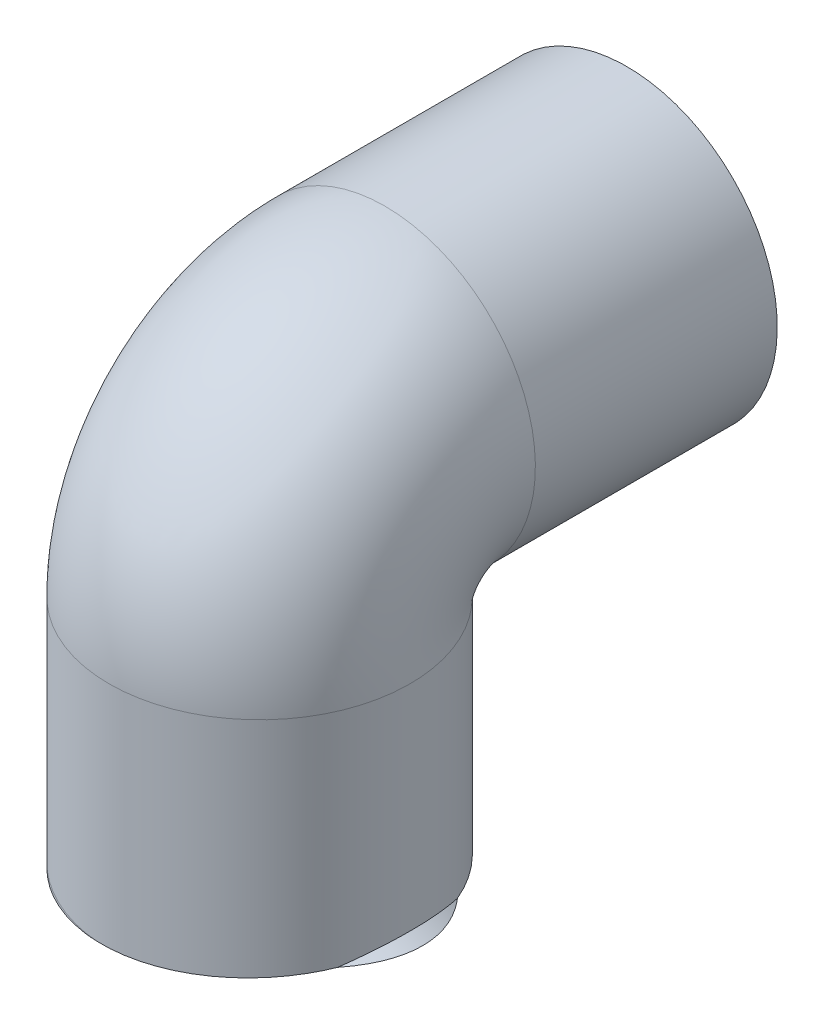
ISO-10303-21;
HEADER;
FILE_DESCRIPTION(('STEP AP214'),'2;1');
FILE_NAME('part.step','',(''),(''),'','','');
FILE_SCHEMA(('AUTOMOTIVE_DESIGN { 1 0 10303 214 1 1 1 1 }'));
ENDSEC;
DATA;
#1=APPLICATION_CONTEXT('core data for automotive mechanical design processes');
#2=APPLICATION_PROTOCOL_DEFINITION('international standard','automotive_design',2000,#1);
#3=PRODUCT_CONTEXT('',#1,'mechanical');
#4=PRODUCT('Part','Part','',(#3));
#5=PRODUCT_RELATED_PRODUCT_CATEGORY('part','',(#4));
#6=PRODUCT_DEFINITION_FORMATION('','',#4);
#7=PRODUCT_DEFINITION_CONTEXT('part definition',#1,'design');
#8=PRODUCT_DEFINITION('design','',#6,#7);
#9=PRODUCT_DEFINITION_SHAPE('','',#8);
#10=(LENGTH_UNIT() NAMED_UNIT(*) SI_UNIT(.MILLI.,.METRE.));
#11=(NAMED_UNIT(*) PLANE_ANGLE_UNIT() SI_UNIT($,.RADIAN.));
#12=(NAMED_UNIT(*) SI_UNIT($,.STERADIAN.) SOLID_ANGLE_UNIT());
#13=UNCERTAINTY_MEASURE_WITH_UNIT(LENGTH_MEASURE(1.E-05),#10,'distance_accuracy_value','');
#14=(GEOMETRIC_REPRESENTATION_CONTEXT(3) GLOBAL_UNCERTAINTY_ASSIGNED_CONTEXT((#13)) GLOBAL_UNIT_ASSIGNED_CONTEXT((#10,
#11,#12)) REPRESENTATION_CONTEXT('',''));
#15=CARTESIAN_POINT('',(0.,0.,0.));
#16=DIRECTION('',(0.,0.,1.));
#17=DIRECTION('',(1.,0.,0.));
#18=AXIS2_PLACEMENT_3D('',#15,#16,#17);
#19=CARTESIAN_POINT('',(-45.,-9.99999999999998,29.2902720223651));
#20=DIRECTION('',(0.,-1.,0.));
#21=DIRECTION('',(0.,0.,-1.));
#22=AXIS2_PLACEMENT_3D('',#19,#20,#21);
#23=CYLINDRICAL_SURFACE('',#22,12.);
#24=CARTESIAN_POINT('',(-45.,-28.3117979739499,29.2902720223659));
#25=DIRECTION('',(0.,-1.,0.));
#26=DIRECTION('',(0.,0.,-1.));
#27=AXIS2_PLACEMENT_3D('',#24,#25,#26);
#28=CIRCLE('',#27,12.);
#29=CARTESIAN_POINT('',(-46.0483542686489,-28.3117979739504,17.3361533460516));
#30=VERTEX_POINT('',#29);
#31=CARTESIAN_POINT('',(-46.0483542686296,-28.3117979739494,41.2443906986818));
#32=VERTEX_POINT('',#31);
#33=EDGE_CURVE('E115',#30,#32,#28,.F.);
#34=ORIENTED_EDGE('',*,*,#33,.T.);
#35=CARTESIAN_POINT('',(-45.,-28.2577590941231,29.2902720223659));
#36=DIRECTION('',(-0.0514780477489432,0.998674126329484,0.));
#37=DIRECTION('',(-0.998674126329484,-0.0514780477489432,8.06030191765794E-13));
#38=AXIS2_PLACEMENT_3D('',#35,#36,#37);
#39=ELLIPSE('',#38,12.0159316073449,12.);
#40=CARTESIAN_POINT('',(-33.9907188725222,-27.6902703762118,34.0647593305657));
#41=VERTEX_POINT('',#40);
#42=EDGE_CURVE('E62',#41,#32,#39,.F.);
#43=ORIENTED_EDGE('',*,*,#42,.F.);
#44=CARTESIAN_POINT('',(-45.,-34.4699196390855,29.290272022366));
#45=DIRECTION('',(0.524361459695173,-0.851495777785391,8.28774193656232E-13));
#46=DIRECTION('',(-0.851495777785391,-0.524361459695173,-1.26669276251364E-12));
#47=AXIS2_PLACEMENT_3D('',#44,#45,#46);
#48=ELLIPSE('',#47,14.0928473317979,12.);
#49=CARTESIAN_POINT('',(-33.9907188725057,-27.690270376211,24.5157847142039));
#50=VERTEX_POINT('',#49);
#51=EDGE_CURVE('E55',#50,#41,#48,.T.);
#52=ORIENTED_EDGE('',*,*,#51,.F.);
#53=EDGE_CURVE('E126',#30,#50,#39,.F.);
#54=ORIENTED_EDGE('',*,*,#53,.F.);
#55=EDGE_LOOP('',(#34,#43,#52,#54));
#56=FACE_BOUND('',#55,.T.);
#57=CARTESIAN_POINT('',(-45.,-9.99999999999997,29.2902720223651));
#58=DIRECTION('',(0.,1.,0.));
#59=DIRECTION('',(0.,0.,1.));
#60=AXIS2_PLACEMENT_3D('',#57,#58,#59);
#61=CIRCLE('',#60,12.);
#62=CARTESIAN_POINT('',(-51.6332495807108,-9.99999999999998,19.2902720223653));
#63=VERTEX_POINT('',#62);
#64=CARTESIAN_POINT('',(-38.3667504192892,-9.99999999999997,19.2902720223651));
#65=VERTEX_POINT('',#64);
#66=EDGE_CURVE('E112',#63,#65,#61,.T.);
#67=ORIENTED_EDGE('',*,*,#66,.F.);
#68=CARTESIAN_POINT('',(-45.,0.,29.2902720223647));
#69=DIRECTION('',(0.,-0.707106781186533,0.707106781186562));
#70=DIRECTION('',(0.,0.707106781186562,0.707106781186533));
#71=AXIS2_PLACEMENT_3D('',#68,#69,#70);
#72=ELLIPSE('',#71,16.9705627484768,12.);
#73=EDGE_CURVE('E12',#63,#65,#72,.T.);
#74=ORIENTED_EDGE('',*,*,#73,.T.);
#75=EDGE_LOOP('',(#67,#74));
#76=FACE_BOUND('',#75,.T.);
#77=ADVANCED_FACE('F47',(#56,#76),#23,.T.);
#78=CARTESIAN_POINT('',(-45.,0.,0.));
#79=DIRECTION('',(0.,0.,1.));
#80=DIRECTION('',(0.,-1.,0.));
#81=AXIS2_PLACEMENT_3D('',#78,#79,#80);
#82=CYLINDRICAL_SURFACE('',#81,12.);
#83=CARTESIAN_POINT('',(-45.,0.,0.));
#84=DIRECTION('',(0.,0.,-1.));
#85=DIRECTION('',(-1.,0.,0.));
#86=AXIS2_PLACEMENT_3D('',#83,#84,#85);
#87=CIRCLE('',#86,12.);
#88=CARTESIAN_POINT('',(-57.,0.,0.));
#89=VERTEX_POINT('',#88);
#90=EDGE_CURVE('E100',#89,#89,#87,.T.);
#91=ORIENTED_EDGE('',*,*,#90,.F.);
#92=EDGE_LOOP('',(#91));
#93=FACE_BOUND('',#92,.T.);
#94=ORIENTED_EDGE('',*,*,#73,.F.);
#95=CARTESIAN_POINT('',(-45.,0.,19.2902720223651));
#96=DIRECTION('',(0.,0.,1.));
#97=DIRECTION('',(0.,-1.,0.));
#98=AXIS2_PLACEMENT_3D('',#95,#96,#97);
#99=CIRCLE('',#98,12.);
#100=EDGE_CURVE('E104',#63,#65,#99,.F.);
#101=ORIENTED_EDGE('',*,*,#100,.T.);
#102=EDGE_LOOP('',(#94,#101));
#103=FACE_BOUND('',#102,.T.);
#104=ADVANCED_FACE('F156',(#93,#103),#82,.T.);
#105=CARTESIAN_POINT('',(-39.5009011917269,-37.2416293532263,29.2902720223743));
#106=DIRECTION('',(0.892983137927648,-0.450090119172695,1.36990259257274E-12));
#107=DIRECTION('',(0.450090119172695,0.892983137927648,0.));
#108=AXIS2_PLACEMENT_3D('',#105,#106,#107);
#109=CYLINDRICAL_SURFACE('',#108,12.);
#110=ORIENTED_EDGE('',*,*,#51,.T.);
#111=CARTESIAN_POINT('',(-56.1814734910168,-28.8341237070621,29.2902720223487));
#112=DIRECTION('',(-0.0514780477489432,0.998674126329484,0.));
#113=DIRECTION('',(0.998674126329484,0.0514780477489432,1.57708523488195E-12));
#114=AXIS2_PLACEMENT_3D('',#111,#112,#113);
#115=ELLIPSE('',#114,24.219800250681,12.);
#116=EDGE_CURVE('E122',#50,#41,#115,.F.);
#117=ORIENTED_EDGE('',*,*,#116,.F.);
#118=EDGE_LOOP('',(#110,#117));
#119=FACE_BOUND('',#118,.T.);
#120=ADVANCED_FACE('F49',(#119),#109,.T.);
#121=CARTESIAN_POINT('',(-45.,0.,0.));
#122=DIRECTION('',(0.,0.,-1.));
#123=DIRECTION('',(-0.00715953619976696,0.999974370192258,0.));
#124=AXIS2_PLACEMENT_3D('',#121,#122,#123);
#125=PLANE('',#124);
#126=CARTESIAN_POINT('',(-45.,0.,0.));
#127=DIRECTION('',(0.,0.,-1.));
#128=DIRECTION('',(-0.00715953619976696,0.999974370192258,0.));
#129=AXIS2_PLACEMENT_3D('',#126,#127,#128);
#130=CIRCLE('',#129,10.);
#131=CARTESIAN_POINT('',(-45.0715953619976,9.99974370192261,0.));
#132=VERTEX_POINT('',#131);
#133=EDGE_CURVE('E138',#132,#132,#130,.T.);
#134=ORIENTED_EDGE('',*,*,#133,.F.);
#135=EDGE_LOOP('',(#134));
#136=FACE_BOUND('',#135,.T.);
#137=ORIENTED_EDGE('',*,*,#90,.T.);
#138=EDGE_LOOP('',(#137));
#139=FACE_BOUND('',#138,.T.);
#140=ADVANCED_FACE('F152',(#136,#139),#125,.T.);
#141=CARTESIAN_POINT('',(-45.,-9.99999999999998,9.29027202236512));
#142=DIRECTION('',(0.,-1.,0.));
#143=DIRECTION('',(0.,0.,-1.));
#144=AXIS2_PLACEMENT_3D('',#141,#142,#143);
#145=CIRCLE('',#144,12.);
#146=TRIMMED_CURVE('',#145,(PARAMETER_VALUE(-2.55590711013264)),
(PARAMETER_VALUE(2.55590711013264)),.T.,.PARAMETER.);
#147=CARTESIAN_POINT('',(-45.,-9.99999999999998,19.2902720223651));
#148=DIRECTION('',(1.,0.,0.));
#149=AXIS1_PLACEMENT('',#147,#148);
#150=SURFACE_OF_REVOLUTION('',#146,#149);
#151=ORIENTED_EDGE('',*,*,#66,.T.);
#152=ORIENTED_EDGE('',*,*,#100,.F.);
#153=EDGE_LOOP('',(#151,#152));
#154=FACE_BOUND('',#153,.T.);
#155=ADVANCED_FACE('F164',(#154),#150,.T.);
#156=CARTESIAN_POINT('',(-35.,-28.3117979739499,29.2902720223812));
#157=DIRECTION('',(-1.53418944215389E-12,0.,1.));
#158=DIRECTION('',(1.,0.,1.53418944215389E-12));
#159=AXIS2_PLACEMENT_3D('',#156,#157,#158);
#160=DEGENERATE_TOROIDAL_SURFACE('',#159,9.99999999999999,12.,.T.);
#161=ORIENTED_EDGE('',*,*,#33,.F.);
#162=CARTESIAN_POINT('',(-46.0444742686339,-28.3115979739496,41.2447303329034));
#163=CARTESIAN_POINT('',(-46.3807961356702,-28.3289341526628,41.215382847976));
#164=CARTESIAN_POINT('',(-46.7158707466066,-28.3462060398245,41.1717666796342));
#165=CARTESIAN_POINT('',(-47.3811523988989,-28.3804989084993,41.0564536513986));
#166=CARTESIAN_POINT('',(-47.7113596369067,-28.3975199001492,40.9847579292211));
#167=CARTESIAN_POINT('',(-48.3643413154665,-28.4311787495595,40.8137975649454));
#168=CARTESIAN_POINT('',(-48.687120608766,-28.4478168574615,40.7145515093431));
#169=CARTESIAN_POINT('',(-49.3231748095924,-28.4806031564732,40.4891796016414));
#170=CARTESIAN_POINT('',(-49.6364498557631,-28.4967513547294,40.363054141863));
#171=CARTESIAN_POINT('',(-50.2513494467384,-28.5284472099343,40.0847728202155));
#172=CARTESIAN_POINT('',(-50.552970878097,-28.5439947063961,39.932610060219));
#173=CARTESIAN_POINT('',(-51.1423240844462,-28.5743737376512,39.6033566066384));
#174=CARTESIAN_POINT('',(-51.4300558669242,-28.5892052728305,39.4262659264923));
#175=CARTESIAN_POINT('',(-51.9895188272621,-28.6180435697552,39.0484534408747));
#176=CARTESIAN_POINT('',(-52.2612533167635,-28.6320505022037,38.847736552315));
#177=CARTESIAN_POINT('',(-52.7868466754261,-28.6591429433719,38.4240703062232));
#178=CARTESIAN_POINT('',(-53.0407056435133,-28.6722284571908,38.2011210717452));
#179=CARTESIAN_POINT('',(-53.5284801875821,-28.6973714749263,37.734822536854));
#180=CARTESIAN_POINT('',(-53.7624165510195,-28.7094300503612,37.4914950386288));
#181=CARTESIAN_POINT('',(-54.2089800079447,-28.7324487852543,36.9859656102363));
#182=CARTESIAN_POINT('',(-54.4216070778088,-28.7434089434947,36.723763659145));
#183=CARTESIAN_POINT('',(-54.8240676290023,-28.7641543327315,36.1823088205501));
#184=CARTESIAN_POINT('',(-55.0138976658245,-28.7739393861759,35.903053365947));
#185=CARTESIAN_POINT('',(-55.3693743018701,-28.7922629241164,35.329514005026));
#186=CARTESIAN_POINT('',(-55.5350209153277,-28.8008014093462,35.035230107554));
#187=CARTESIAN_POINT('',(-55.8408767310137,-28.8165671730413,34.4338730073975));
#188=CARTESIAN_POINT('',(-55.9810981598734,-28.8237950817454,34.1268060397425));
#189=CARTESIAN_POINT('',(-56.235203683084,-28.8368933045913,33.5019335391406));
#190=CARTESIAN_POINT('',(-56.3490877845882,-28.8427636191019,33.1841280091104));
#191=CARTESIAN_POINT('',(-56.5497019405398,-28.8531045549757,32.5400576190158));
#192=CARTESIAN_POINT('',(-56.6364336106673,-28.8575752596214,32.2137932635373));
#193=CARTESIAN_POINT('',(-56.7821347160672,-28.8650856258791,31.5551072383114));
#194=CARTESIAN_POINT('',(-56.8411041542452,-28.8681252876409,31.2226855692084));
#195=CARTESIAN_POINT('',(-56.9308540324636,-28.8727515700233,30.5541011490722));
#196=CARTESIAN_POINT('',(-56.9616388587507,-28.8743384167391,30.2179389883998));
#197=CARTESIAN_POINT('',(-56.9948162047469,-28.8760485892131,29.5442127994307));
#198=CARTESIAN_POINT('',(-56.9972087271206,-28.8761719151087,29.2066487712656));
#199=CARTESIAN_POINT('',(-56.9735843814923,-28.874954165334,28.5325172385058));
#200=CARTESIAN_POINT('',(-56.9475673695721,-28.8736130822454,28.1959497389679));
#201=CARTESIAN_POINT('',(-56.8673088813866,-28.8694760467719,27.5262060100287));
#202=CARTESIAN_POINT('',(-56.8130674063026,-28.866680094448,27.1930297804854));
#203=CARTESIAN_POINT('',(-56.676750503446,-28.8596534499708,26.5324591925691));
#204=CARTESIAN_POINT('',(-56.5946769099874,-28.8554228523699,26.2050644546546));
#205=CARTESIAN_POINT('',(-56.4032789317991,-28.8455569772055,25.5583615373395));
#206=CARTESIAN_POINT('',(-56.2939545453277,-28.8399216995524,25.2390533584557));
#207=CARTESIAN_POINT('',(-56.04882896035,-28.8272863601205,24.6107831622679));
#208=CARTESIAN_POINT('',(-55.9130269223987,-28.8202862550715,24.3018214733522));
#209=CARTESIAN_POINT('',(-55.6159145972835,-28.8049711867666,23.6964508612128));
#210=CARTESIAN_POINT('',(-55.4546043208251,-28.7966562240625,23.4000419327211));
#211=CARTESIAN_POINT('',(-55.1076113023777,-28.7787699859982,22.8218631070361));
#212=CARTESIAN_POINT('',(-54.9219268919549,-28.7691986246362,22.5400942138124));
#213=CARTESIAN_POINT('',(-54.5275149481603,-28.7488681120695,21.9932186462907));
#214=CARTESIAN_POINT('',(-54.3187873637541,-28.7381089582341,21.728112008897));
#215=CARTESIAN_POINT('',(-53.8797839896673,-28.7154799183328,21.2164556402656));
#216=CARTESIAN_POINT('',(-53.6495091312411,-28.7036100802695,20.9699051078795));
#217=CARTESIAN_POINT('',(-53.1690437375481,-28.6788438228627,20.4971006291865));
#218=CARTESIAN_POINT('',(-52.9188533850374,-28.6659474129395,20.2708464966685));
#219=CARTESIAN_POINT('',(-52.4002553338577,-28.6392155546312,19.8401713107498));
#220=CARTESIAN_POINT('',(-52.131842067089,-28.6253798192308,19.6357569801568));
#221=CARTESIAN_POINT('',(-51.5787645205117,-28.5968706673453,19.2502830394653));
#222=CARTESIAN_POINT('',(-51.2940996323647,-28.5821972195027,19.0692243044524));
#223=CARTESIAN_POINT('',(-50.7105978507039,-28.5521198080769,18.7317771435374));
#224=CARTESIAN_POINT('',(-50.4117628369921,-28.5367159413907,18.5753854571591));
#225=CARTESIAN_POINT('',(-49.802031733743,-28.5052865030789,18.2883629120518));
#226=CARTESIAN_POINT('',(-49.4911373912208,-28.4892610215056,18.1577283384889));
#227=CARTESIAN_POINT('',(-48.9237268194907,-28.4600130538907,17.9469769658043));
#228=CARTESIAN_POINT('',(-48.6690013565219,-28.4468828753871,17.8619890130669));
#229=CARTESIAN_POINT('',(-48.1544596428669,-28.420360106642,17.709311718246));
#230=CARTESIAN_POINT('',(-47.8946441409904,-28.4069675549989,17.6416198519593));
#231=CARTESIAN_POINT('',(-47.3712956624572,-28.3799908293013,17.5238795488438));
#232=CARTESIAN_POINT('',(-47.1077660947761,-28.3664068309672,17.4738159054743));
#233=CARTESIAN_POINT('',(-46.5779111861009,-28.3390947222726,17.3914432138012));
#234=CARTESIAN_POINT('',(-46.3115854079729,-28.3253665893794,17.3591369849502));
#235=CARTESIAN_POINT('',(-46.0444742686339,-28.3115979739496,17.3358137118284));
#236=B_SPLINE_CURVE_WITH_KNOTS('',3,(#162,#163,#164,#165,#166,#167,#168,#169,#170,#171,#172,
#173,#174,#175,#176,#177,#178,#179,#180,#181,#182,#183,#184,#185,#186,#187,#188,#189,#190,#191,
#192,#193,#194,#195,#196,#197,#198,#199,#200,#201,#202,#203,#204,#205,#206,#207,#208,#209,#210,
#211,#212,#213,#214,#215,#216,#217,#218,#219,#220,#221,#222,#223,#224,#225,#226,#227,#228,#229,
#230,#231,#232,#233,#234,#235),.UNSPECIFIED.,.F.,.F.,(4,2,2,2,2,2,2,2,2,2,2,2,2,2,2,2,2,2,2,2,2,
2,2,2,2,2,2,2,2,2,2,2,2,2,2,2,4),(0.,1.01382687708374,2.02761268057825,3.04071620110709,
4.05380493579337,5.06716248736315,6.08051949265909,7.09366597721853,8.10680685441445,
9.11887731602804,10.1309488996184,11.1431732098116,12.1553969242092,13.1671325752659,
14.1788679515266,15.1905431139693,16.2022181705298,17.213735757789,18.2252532501196,
19.2367758666658,20.2482984408734,21.2597543622495,22.2712103482778,23.2826984066275,
24.2941860404673,25.3057429477865,26.3173020954797,27.3288175446458,28.3403237126267,
29.3521403544573,30.3639948959575,31.3757155788233,32.3872902388003,33.193263787785,
33.9991196451406,34.8042786384323,35.6095654348039),.UNSPECIFIED.);
#237=EDGE_CURVE('E97',#32,#30,#236,.T.);
#238=ORIENTED_EDGE('',*,*,#237,.F.);
#239=EDGE_LOOP('',(#161,#238));
#240=FACE_BOUND('',#239,.T.);
#241=ADVANCED_FACE('F165',(#240),#160,.T.);
#242=CARTESIAN_POINT('',(-45.,0.,0.));
#243=DIRECTION('',(0.,0.,1.));
#244=DIRECTION('',(0.,-1.,0.));
#245=AXIS2_PLACEMENT_3D('',#242,#243,#244);
#246=CYLINDRICAL_SURFACE('',#245,10.);
#247=CARTESIAN_POINT('',(-45.,0.,19.2902720223651));
#248=DIRECTION('',(0.,0.,-1.));
#249=DIRECTION('',(-0.00715953619976696,0.999974370192258,0.));
#250=AXIS2_PLACEMENT_3D('',#247,#248,#249);
#251=CIRCLE('',#250,10.);
#252=CARTESIAN_POINT('',(-45.,-9.99999999999998,19.2902720223651));
#253=VERTEX_POINT('',#252);
#254=EDGE_CURVE('E106',#253,#253,#251,.T.);
#255=ORIENTED_EDGE('',*,*,#254,.F.);
#256=EDGE_LOOP('',(#255));
#257=FACE_BOUND('',#256,.T.);
#258=ORIENTED_EDGE('',*,*,#133,.T.);
#259=EDGE_LOOP('',(#258));
#260=FACE_BOUND('',#259,.T.);
#261=ADVANCED_FACE('F153',(#257,#260),#246,.F.);
#262=CARTESIAN_POINT('',(-45.,-9.99999999999998,9.29027202236512));
#263=DIRECTION('',(0.,-1.,0.));
#264=DIRECTION('',(0.,0.,-1.));
#265=AXIS2_PLACEMENT_3D('',#262,#263,#264);
#266=CIRCLE('',#265,10.);
#267=TRIMMED_CURVE('',#266,(PARAMETER_VALUE(-3.14159261708955)),
(PARAMETER_VALUE(3.14159261708955)),.T.,.PARAMETER.);
#268=CARTESIAN_POINT('',(-45.,-9.99999999999998,19.2902720223651));
#269=DIRECTION('',(1.,0.,0.));
#270=AXIS1_PLACEMENT('',#268,#269);
#271=SURFACE_OF_REVOLUTION('',#267,#270);
#272=CARTESIAN_POINT('',(-45.,-9.99999999999997,29.2902720223651));
#273=DIRECTION('',(0.,1.,0.));
#274=DIRECTION('',(-0.00715953619976696,0.,0.999974370192258));
#275=AXIS2_PLACEMENT_3D('',#272,#273,#274);
#276=CIRCLE('',#275,10.);
#277=EDGE_CURVE('E101',#253,#253,#276,.T.);
#278=ORIENTED_EDGE('',*,*,#277,.F.);
#279=ORIENTED_EDGE('',*,*,#254,.T.);
#280=EDGE_LOOP('',(#278,#279));
#281=FACE_BOUND('',#280,.T.);
#282=ADVANCED_FACE('F143',(#281),#271,.F.);
#283=CARTESIAN_POINT('',(-45.,-9.99999999999998,29.2902720223651));
#284=DIRECTION('',(0.,-1.,0.));
#285=DIRECTION('',(0.,0.,-1.));
#286=AXIS2_PLACEMENT_3D('',#283,#284,#285);
#287=CYLINDRICAL_SURFACE('',#286,10.);
#288=CARTESIAN_POINT('',(-45.,-28.2577590941231,29.2902720223659));
#289=DIRECTION('',(-0.0514780477489432,0.998674126329484,0.));
#290=DIRECTION('',(-0.998674126329484,-0.0514780477489432,8.06030191765794E-13));
#291=AXIS2_PLACEMENT_3D('',#288,#289,#290);
#292=ELLIPSE('',#291,10.0132763394541,10.);
#293=CARTESIAN_POINT('',(-46.0483542686472,-28.3117979739503,19.3453761794015));
#294=VERTEX_POINT('',#293);
#295=CARTESIAN_POINT('',(-46.0483542686312,-28.3117979739494,39.2351678653319));
#296=VERTEX_POINT('',#295);
#297=EDGE_CURVE('E69',#294,#296,#292,.F.);
#298=ORIENTED_EDGE('',*,*,#297,.T.);
#299=CARTESIAN_POINT('',(-45.,-28.3117979739499,29.2902720223659));
#300=DIRECTION('',(0.,1.,0.));
#301=DIRECTION('',(-0.00715953619976696,0.,0.999974370192258));
#302=AXIS2_PLACEMENT_3D('',#299,#300,#301);
#303=CIRCLE('',#302,10.);
#304=EDGE_CURVE('E96',#294,#296,#303,.T.);
#305=ORIENTED_EDGE('',*,*,#304,.F.);
#306=EDGE_LOOP('',(#298,#305));
#307=FACE_BOUND('',#306,.T.);
#308=ORIENTED_EDGE('',*,*,#277,.T.);
#309=EDGE_LOOP('',(#308));
#310=FACE_BOUND('',#309,.T.);
#311=ADVANCED_FACE('F94',(#307,#310),#287,.F.);
#312=CARTESIAN_POINT('',(-35.,-28.3117979739499,29.2902720223812));
#313=DIRECTION('',(-1.53418944215389E-12,0.,1.));
#314=DIRECTION('',(1.,0.,1.53418944215389E-12));
#315=AXIS2_PLACEMENT_3D('',#312,#313,#314);
#316=DEGENERATE_TOROIDAL_SURFACE('',#315,9.99999999999999,10.,.T.);
#317=CARTESIAN_POINT('',(-46.0444742686389,-28.3115979739498,39.2355761151711));
#318=CARTESIAN_POINT('',(-46.2766018522213,-28.3235633133098,39.2112120536315));
#319=CARTESIAN_POINT('',(-46.5078727078547,-28.3354844914352,39.178691178163));
#320=CARTESIAN_POINT('',(-46.9675476337742,-28.3591790752455,39.0975555893587));
#321=CARTESIAN_POINT('',(-47.1959521084752,-28.3709525017765,39.0489431734716));
#322=CARTESIAN_POINT('',(-47.6489578313047,-28.3943033122316,38.9357997545522));
#323=CARTESIAN_POINT('',(-47.8735564598125,-28.4058805611237,38.8712582278159));
#324=CARTESIAN_POINT('',(-48.3177104517214,-28.4287750967891,38.7265853978372));
#325=CARTESIAN_POINT('',(-48.5372651807068,-28.4400923508606,38.6464521453598));
#326=CARTESIAN_POINT('',(-49.0143987879229,-28.4646868666964,38.4530811490304));
#327=CARTESIAN_POINT('',(-49.2706041523244,-28.477893328779,38.3364249677971));
#328=CARTESIAN_POINT('',(-49.7722988826694,-28.5037538818896,38.0818875560666));
#329=CARTESIAN_POINT('',(-50.0177869363761,-28.5164079052765,37.9440037357426));
#330=CARTESIAN_POINT('',(-50.4962900001586,-28.541073011657,37.6479868520643));
#331=CARTESIAN_POINT('',(-50.7293043909121,-28.5530840627268,37.4898527845969));
#332=CARTESIAN_POINT('',(-51.1811799922619,-28.5763766194974,37.1544653548562));
#333=CARTESIAN_POINT('',(-51.4000411763159,-28.5876581238301,36.9772119567288));
#334=CARTESIAN_POINT('',(-51.8217973959385,-28.6093981351508,36.6050683090186));
#335=CARTESIAN_POINT('',(-52.0247110850246,-28.6198576036604,36.4101992558929));
#336=CARTESIAN_POINT('',(-52.4134159196407,-28.6398939353417,36.0040283654161));
#337=CARTESIAN_POINT('',(-52.5992069396724,-28.6494707920444,35.7927264076433));
#338=CARTESIAN_POINT('',(-52.9523513817705,-28.667674113802,35.3551799901027));
#339=CARTESIAN_POINT('',(-53.1197036880652,-28.6763005213429,35.1289346273965));
#340=CARTESIAN_POINT('',(-53.4347644950019,-28.6925407691232,34.6631227476248));
#341=CARTESIAN_POINT('',(-53.5824730375875,-28.7001546115245,34.4235562590042));
#342=CARTESIAN_POINT('',(-53.8571129410242,-28.7143113075779,33.9329508312457));
#343=CARTESIAN_POINT('',(-53.984056449513,-28.720854787397,33.6819187103115));
#344=CARTESIAN_POINT('',(-54.2163672961461,-28.7328295733059,33.1700363144682));
#345=CARTESIAN_POINT('',(-54.321734634576,-28.7382608794105,32.9091860396892));
#346=CARTESIAN_POINT('',(-54.5101390251123,-28.747972445933,32.3795327265498));
#347=CARTESIAN_POINT('',(-54.5931769378792,-28.7522527507148,32.1107299951507));
#348=CARTESIAN_POINT('',(-54.7363364295933,-28.7596321059578,31.5670740115022));
#349=CARTESIAN_POINT('',(-54.7964580128602,-28.7627311566417,31.2922207603933));
#350=CARTESIAN_POINT('',(-54.8933449899367,-28.7677253307178,30.7384855059503));
#351=CARTESIAN_POINT('',(-54.9301160003869,-28.7696207436276,30.4596044879556));
#352=CARTESIAN_POINT('',(-54.9800629655366,-28.77219532946,29.8997319313781));
#353=CARTESIAN_POINT('',(-54.9932389239012,-28.7728745025716,29.618740393123));
#354=CARTESIAN_POINT('',(-54.9959019854151,-28.7730117737837,29.0566451896113));
#355=CARTESIAN_POINT('',(-54.9853891219306,-28.7724698736041,28.7755415245132));
#356=CARTESIAN_POINT('',(-54.9407494524254,-28.770168859712,28.2152204799981));
#357=CARTESIAN_POINT('',(-54.906622647607,-28.7684097460616,27.9360031004851));
#358=CARTESIAN_POINT('',(-54.8150026494858,-28.7636870657461,27.3814677662573));
#359=CARTESIAN_POINT('',(-54.7575117980005,-28.7607236197932,27.1061494235967));
#360=CARTESIAN_POINT('',(-54.6195729912444,-28.7536133720223,26.5613406450313));
#361=CARTESIAN_POINT('',(-54.5391250356544,-28.7494665701878,26.2918502092076));
#362=CARTESIAN_POINT('',(-54.3558408050942,-28.7400189294372,25.7606017373421));
#363=CARTESIAN_POINT('',(-54.2530036074566,-28.7347180429611,25.4988440204731));
#364=CARTESIAN_POINT('',(-54.0256747990927,-28.7230000631485,24.9849330030179));
#365=CARTESIAN_POINT('',(-53.9011831940118,-28.7165829701031,24.7327796999279));
#366=CARTESIAN_POINT('',(-53.6314201289321,-28.7026776574701,24.2398482789395));
#367=CARTESIAN_POINT('',(-53.4861469130528,-28.6951893473732,23.999071124524));
#368=CARTESIAN_POINT('',(-53.175862244356,-28.6791952922858,23.530625087574));
#369=CARTESIAN_POINT('',(-53.010850759817,-28.6706895456601,23.3029562261068));
#370=CARTESIAN_POINT('',(-52.6622782295569,-28.6527218894611,22.8623620321393));
#371=CARTESIAN_POINT('',(-52.478718689828,-28.6432600575163,22.6494355050108));
#372=CARTESIAN_POINT('',(-52.0943460496781,-28.6234470348281,22.2398183081736));
#373=CARTESIAN_POINT('',(-51.8935330633556,-28.6130958499662,22.0431275311134));
#374=CARTESIAN_POINT('',(-51.4760169909909,-28.5915744029371,21.6673177513135));
#375=CARTESIAN_POINT('',(-51.2593090496358,-28.5804038904961,21.488204157134));
#376=CARTESIAN_POINT('',(-50.8115989363102,-28.557326049603,21.1488873326391));
#377=CARTESIAN_POINT('',(-50.5805967882015,-28.5454187223809,20.9886840707574));
#378=CARTESIAN_POINT('',(-50.1059440797295,-28.5209520879236,20.6883229576136));
#379=CARTESIAN_POINT('',(-49.8622934940256,-28.5083927793821,20.548165146514));
#380=CARTESIAN_POINT('',(-49.3640891175464,-28.4827121414193,20.2888949477734));
#381=CARTESIAN_POINT('',(-49.1095364191921,-28.4695908683083,20.169780457637));
#382=CARTESIAN_POINT('',(-48.6268646621274,-28.4447108808307,19.9682582808794));
#383=CARTESIAN_POINT('',(-48.3999032691497,-28.4330118399556,19.8830572930234));
#384=CARTESIAN_POINT('',(-47.9404175264669,-28.4093270078585,19.7293868445926));
#385=CARTESIAN_POINT('',(-47.7078937484939,-28.3973412461073,19.6609156724802));
#386=CARTESIAN_POINT('',(-47.2386017407963,-28.3731509364322,19.5410860230618));
#387=CARTESIAN_POINT('',(-47.0018354424247,-28.3609464880625,19.4897199574727));
#388=CARTESIAN_POINT('',(-46.5251785220563,-28.3363765437136,19.4042967747911));
#389=CARTESIAN_POINT('',(-46.28528751285,-28.3240110277752,19.3702418242031));
#390=CARTESIAN_POINT('',(-46.0444742686389,-28.3115979739498,19.3449679295606));
#391=B_SPLINE_CURVE_WITH_KNOTS('',3,(#317,#318,#319,#320,#321,#322,#323,#324,#325,#326,#327,
#328,#329,#330,#331,#332,#333,#334,#335,#336,#337,#338,#339,#340,#341,#342,#343,#344,#345,#346,
#347,#348,#349,#350,#351,#352,#353,#354,#355,#356,#357,#358,#359,#360,#361,#362,#363,#364,#365,
#366,#367,#368,#369,#370,#371,#372,#373,#374,#375,#376,#377,#378,#379,#380,#381,#382,#383,#384,
#385,#386,#387,#388,#389,#390),.UNSPECIFIED.,.F.,.F.,(4,2,2,2,2,2,2,2,2,2,2,2,2,2,2,2,2,2,2,2,2,
2,2,2,2,2,2,2,2,2,2,2,2,2,2,2,4),(0.,0.700980257339684,1.40186047626719,2.10320498307805,
2.80463722646784,3.64907249088169,4.49361086034252,5.33819112265039,6.18277296880079,
7.02635174580794,7.86993670521722,8.71357268401149,9.55720686143801,10.4003457302906,
11.2434845879887,12.0865909432703,12.9296971396276,13.7726004621554,14.615503653749,
15.458405658098,16.3013076195275,17.1441251163097,17.986942624811,18.8297948726509,
19.6726469007525,20.5155701852416,21.3584948244142,22.2013510780083,23.0442017581486,
23.8873109784766,24.7304187914101,25.573528293546,26.416553510616,27.1440575205426,
27.8714870722528,28.5985934854911,29.3257908744824),.UNSPECIFIED.);
#392=EDGE_CURVE('E87',#296,#294,#391,.T.);
#393=ORIENTED_EDGE('',*,*,#392,.T.);
#394=ORIENTED_EDGE('',*,*,#304,.T.);
#395=EDGE_LOOP('',(#393,#394));
#396=FACE_BOUND('',#395,.T.);
#397=ADVANCED_FACE('F99',(#396),#316,.F.);
#398=CARTESIAN_POINT('',(63.1854676358121,-22.6811885974317,43.4952080059008));
#399=DIRECTION('',(-0.0514780477489432,0.998674126329484,0.));
#400=DIRECTION('',(-0.998674126329484,-0.0514780477489432,0.));
#401=AXIS2_PLACEMENT_3D('',#398,#399,#400);
#402=PLANE('',#401);
#403=ORIENTED_EDGE('',*,*,#392,.F.);
#404=ORIENTED_EDGE('',*,*,#297,.F.);
#405=EDGE_LOOP('',(#403,#404));
#406=FACE_BOUND('',#405,.T.);
#407=ORIENTED_EDGE('',*,*,#116,.T.);
#408=ORIENTED_EDGE('',*,*,#42,.T.);
#409=ORIENTED_EDGE('',*,*,#237,.T.);
#410=ORIENTED_EDGE('',*,*,#53,.T.);
#411=EDGE_LOOP('',(#407,#408,#409,#410));
#412=FACE_BOUND('',#411,.T.);
#413=ADVANCED_FACE('F88',(#406,#412),#402,.F.);
#414=CLOSED_SHELL('',(#77,#104,#120,#140,#155,#241,#261,#282,#311,#397,#413));
#415=MANIFOLD_SOLID_BREP('B2',#414);
#416=ADVANCED_BREP_SHAPE_REPRESENTATION('',(#18,#415),#14);
#417=SHAPE_DEFINITION_REPRESENTATION(#9,#416);
ENDSEC;
END-ISO-10303-21;
